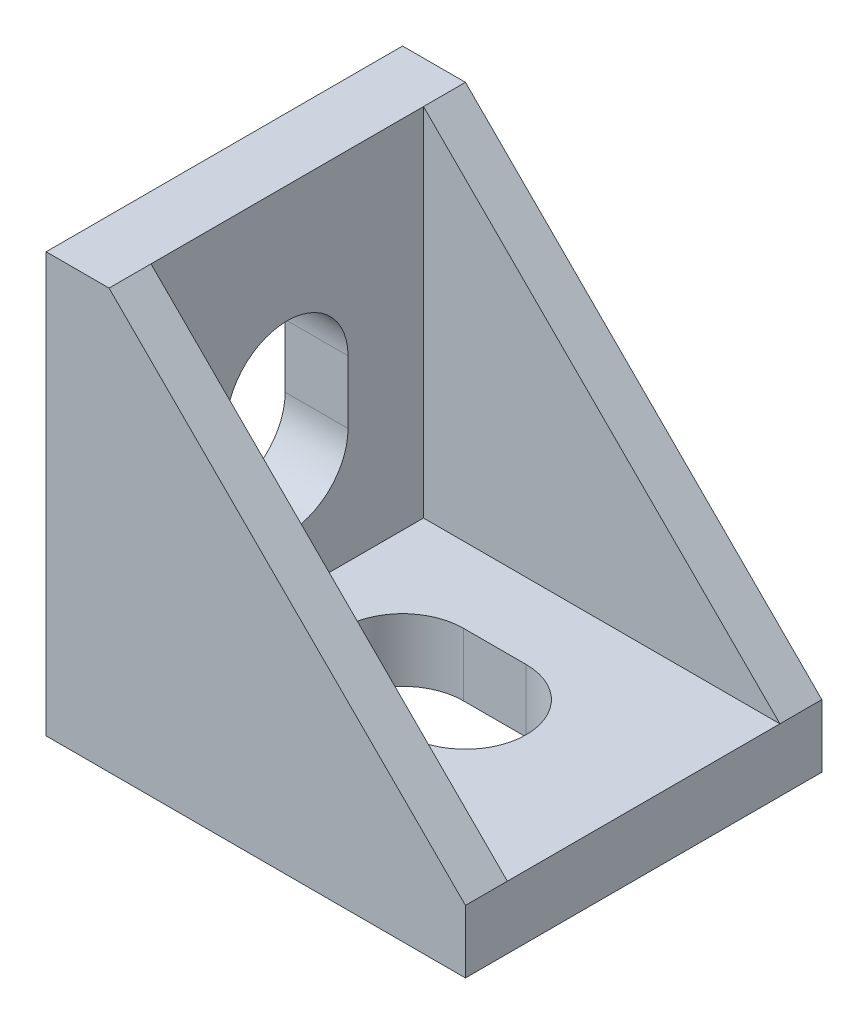
ISO-10303-21;
HEADER;
FILE_DESCRIPTION(('STEP AP214'),'2;1');
FILE_NAME('part.step','',(''),(''),'','','');
FILE_SCHEMA(('AUTOMOTIVE_DESIGN { 1 0 10303 214 1 1 1 1 }'));
ENDSEC;
DATA;
#1=APPLICATION_CONTEXT('core data for automotive mechanical design processes');
#2=APPLICATION_PROTOCOL_DEFINITION('international standard','automotive_design',2000,#1);
#3=PRODUCT_CONTEXT('',#1,'mechanical');
#4=PRODUCT('Part','Part','',(#3));
#5=PRODUCT_RELATED_PRODUCT_CATEGORY('part','',(#4));
#6=PRODUCT_DEFINITION_FORMATION('','',#4);
#7=PRODUCT_DEFINITION_CONTEXT('part definition',#1,'design');
#8=PRODUCT_DEFINITION('design','',#6,#7);
#9=PRODUCT_DEFINITION_SHAPE('','',#8);
#10=(LENGTH_UNIT() NAMED_UNIT(*) SI_UNIT(.MILLI.,.METRE.));
#11=(NAMED_UNIT(*) PLANE_ANGLE_UNIT() SI_UNIT($,.RADIAN.));
#12=(NAMED_UNIT(*) SI_UNIT($,.STERADIAN.) SOLID_ANGLE_UNIT());
#13=UNCERTAINTY_MEASURE_WITH_UNIT(LENGTH_MEASURE(1.E-05),#10,'distance_accuracy_value','');
#14=(GEOMETRIC_REPRESENTATION_CONTEXT(3) GLOBAL_UNCERTAINTY_ASSIGNED_CONTEXT((#13)) GLOBAL_UNIT_ASSIGNED_CONTEXT((#10,
#11,#12)) REPRESENTATION_CONTEXT('',''));
#15=CARTESIAN_POINT('',(0.,0.,0.));
#16=DIRECTION('',(0.,0.,1.));
#17=DIRECTION('',(1.,0.,0.));
#18=AXIS2_PLACEMENT_3D('',#15,#16,#17);
#19=CARTESIAN_POINT('',(20.,0.,8.5));
#20=DIRECTION('',(0.,1.,0.));
#21=DIRECTION('',(-1.,0.,0.));
#22=AXIS2_PLACEMENT_3D('',#19,#20,#21);
#23=PLANE('',#22);
#24=DIRECTION('',(0.,0.,1.));
#25=VECTOR('',#24,1.);
#26=CARTESIAN_POINT('',(3.35,0.,2.));
#27=LINE('',#26,#25);
#28=CARTESIAN_POINT('',(3.35,0.,-2.));
#29=VERTEX_POINT('',#28);
#30=CARTESIAN_POINT('',(3.35,0.,2.));
#31=VERTEX_POINT('',#30);
#32=EDGE_CURVE('E266',#29,#31,#27,.T.);
#33=ORIENTED_EDGE('',*,*,#32,.F.);
#34=DIRECTION('',(1.,0.,0.));
#35=VECTOR('',#34,1.);
#36=CARTESIAN_POINT('',(1.5,0.,-2.));
#37=LINE('',#36,#35);
#38=CARTESIAN_POINT('',(1.5,0.,-2.));
#39=VERTEX_POINT('',#38);
#40=EDGE_CURVE('E279',#39,#29,#37,.T.);
#41=ORIENTED_EDGE('',*,*,#40,.F.);
#42=DIRECTION('',(0.,0.,-1.));
#43=VECTOR('',#42,1.);
#44=CARTESIAN_POINT('',(1.5,0.,2.));
#45=LINE('',#44,#43);
#46=CARTESIAN_POINT('',(1.5,0.,2.));
#47=VERTEX_POINT('',#46);
#48=EDGE_CURVE('E288',#47,#39,#45,.T.);
#49=ORIENTED_EDGE('',*,*,#48,.F.);
#50=DIRECTION('',(-1.,0.,0.));
#51=VECTOR('',#50,1.);
#52=CARTESIAN_POINT('',(1.5,0.,2.));
#53=LINE('',#52,#51);
#54=EDGE_CURVE('E269',#31,#47,#53,.T.);
#55=ORIENTED_EDGE('',*,*,#54,.F.);
#56=EDGE_LOOP('',(#33,#41,#49,#55));
#57=FACE_BOUND('',#56,.T.);
#58=DIRECTION('',(1.,0.,0.));
#59=VECTOR('',#58,1.);
#60=CARTESIAN_POINT('',(11.5,0.,2.9));
#61=LINE('',#60,#59);
#62=CARTESIAN_POINT('',(8.5,0.,2.9));
#63=VERTEX_POINT('',#62);
#64=CARTESIAN_POINT('',(11.5,0.,2.9));
#65=VERTEX_POINT('',#64);
#66=EDGE_CURVE('E381',#63,#65,#61,.T.);
#67=ORIENTED_EDGE('',*,*,#66,.T.);
#68=CARTESIAN_POINT('',(11.5,0.,0.));
#69=DIRECTION('',(0.,1.,0.));
#70=DIRECTION('',(-1.,0.,0.));
#71=AXIS2_PLACEMENT_3D('',#68,#69,#70);
#72=CIRCLE('',#71,2.9);
#73=CARTESIAN_POINT('',(11.5,0.,-2.9));
#74=VERTEX_POINT('',#73);
#75=EDGE_CURVE('E371',#65,#74,#72,.T.);
#76=ORIENTED_EDGE('',*,*,#75,.T.);
#77=DIRECTION('',(-1.,0.,0.));
#78=VECTOR('',#77,1.);
#79=CARTESIAN_POINT('',(11.5,0.,-2.9));
#80=LINE('',#79,#78);
#81=CARTESIAN_POINT('',(8.5,0.,-2.9));
#82=VERTEX_POINT('',#81);
#83=EDGE_CURVE('E374',#74,#82,#80,.T.);
#84=ORIENTED_EDGE('',*,*,#83,.T.);
#85=CARTESIAN_POINT('',(8.5,0.,0.));
#86=DIRECTION('',(0.,1.,0.));
#87=DIRECTION('',(-1.,0.,0.));
#88=AXIS2_PLACEMENT_3D('',#85,#86,#87);
#89=CIRCLE('',#88,2.9);
#90=EDGE_CURVE('E378',#82,#63,#89,.T.);
#91=ORIENTED_EDGE('',*,*,#90,.T.);
#92=EDGE_LOOP('',(#67,#76,#84,#91));
#93=FACE_BOUND('',#92,.T.);
#94=DIRECTION('',(1.,0.,0.));
#95=VECTOR('',#94,1.);
#96=CARTESIAN_POINT('',(20.,0.,-8.5));
#97=LINE('',#96,#95);
#98=CARTESIAN_POINT('',(0.,0.,-8.5));
#99=VERTEX_POINT('',#98);
#100=CARTESIAN_POINT('',(20.,0.,-8.5));
#101=VERTEX_POINT('',#100);
#102=EDGE_CURVE('E455',#99,#101,#97,.T.);
#103=ORIENTED_EDGE('',*,*,#102,.T.);
#104=DIRECTION('',(0.,0.,-1.));
#105=VECTOR('',#104,1.);
#106=CARTESIAN_POINT('',(20.,0.,8.5));
#107=LINE('',#106,#105);
#108=CARTESIAN_POINT('',(20.,0.,8.5));
#109=VERTEX_POINT('',#108);
#110=EDGE_CURVE('E11',#109,#101,#107,.T.);
#111=ORIENTED_EDGE('',*,*,#110,.F.);
#112=DIRECTION('',(1.,0.,0.));
#113=VECTOR('',#112,1.);
#114=CARTESIAN_POINT('',(20.,0.,8.5));
#115=LINE('',#114,#113);
#116=CARTESIAN_POINT('',(0.,0.,8.5));
#117=VERTEX_POINT('',#116);
#118=EDGE_CURVE('E459',#117,#109,#115,.T.);
#119=ORIENTED_EDGE('',*,*,#118,.F.);
#120=DIRECTION('',(0.,0.,-1.));
#121=VECTOR('',#120,1.);
#122=CARTESIAN_POINT('',(0.,0.,8.5));
#123=LINE('',#122,#121);
#124=EDGE_CURVE('E471',#117,#99,#123,.T.);
#125=ORIENTED_EDGE('',*,*,#124,.T.);
#126=EDGE_LOOP('',(#103,#111,#119,#125));
#127=FACE_BOUND('',#126,.T.);
#128=DIRECTION('',(0.,0.,1.));
#129=VECTOR('',#128,1.);
#130=CARTESIAN_POINT('',(18.5,0.,2.));
#131=LINE('',#130,#129);
#132=CARTESIAN_POINT('',(18.5,0.,-2.));
#133=VERTEX_POINT('',#132);
#134=CARTESIAN_POINT('',(18.5,0.,2.));
#135=VERTEX_POINT('',#134);
#136=EDGE_CURVE('E265',#133,#135,#131,.T.);
#137=ORIENTED_EDGE('',*,*,#136,.F.);
#138=DIRECTION('',(1.,0.,0.));
#139=VECTOR('',#138,1.);
#140=CARTESIAN_POINT('',(18.5,0.,-2.));
#141=LINE('',#140,#139);
#142=CARTESIAN_POINT('',(16.65,0.,-2.));
#143=VERTEX_POINT('',#142);
#144=EDGE_CURVE('E262',#143,#133,#141,.T.);
#145=ORIENTED_EDGE('',*,*,#144,.F.);
#146=DIRECTION('',(0.,0.,-1.));
#147=VECTOR('',#146,1.);
#148=CARTESIAN_POINT('',(16.65,0.,2.));
#149=LINE('',#148,#147);
#150=CARTESIAN_POINT('',(16.65,0.,2.));
#151=VERTEX_POINT('',#150);
#152=EDGE_CURVE('E56',#151,#143,#149,.T.);
#153=ORIENTED_EDGE('',*,*,#152,.F.);
#154=DIRECTION('',(-1.,0.,0.));
#155=VECTOR('',#154,1.);
#156=CARTESIAN_POINT('',(18.5,0.,2.));
#157=LINE('',#156,#155);
#158=EDGE_CURVE('E51',#135,#151,#157,.T.);
#159=ORIENTED_EDGE('',*,*,#158,.F.);
#160=EDGE_LOOP('',(#137,#145,#153,#159));
#161=FACE_BOUND('',#160,.T.);
#162=ADVANCED_FACE('F37',(#57,#93,#127,#161),#23,.F.);
#163=CARTESIAN_POINT('',(0.,0.,8.5));
#164=DIRECTION('',(1.,0.,0.));
#165=DIRECTION('',(0.,0.,-1.));
#166=AXIS2_PLACEMENT_3D('',#163,#164,#165);
#167=PLANE('',#166);
#168=DIRECTION('',(0.,1.,0.));
#169=VECTOR('',#168,1.);
#170=CARTESIAN_POINT('',(0.,18.5,2.));
#171=LINE('',#170,#169);
#172=CARTESIAN_POINT('',(0.,16.65,2.));
#173=VERTEX_POINT('',#172);
#174=CARTESIAN_POINT('',(0.,18.5,2.));
#175=VERTEX_POINT('',#174);
#176=EDGE_CURVE('E337',#173,#175,#171,.T.);
#177=ORIENTED_EDGE('',*,*,#176,.F.);
#178=DIRECTION('',(0.,0.,1.));
#179=VECTOR('',#178,1.);
#180=CARTESIAN_POINT('',(0.,16.65,-2.));
#181=LINE('',#180,#179);
#182=CARTESIAN_POINT('',(0.,16.65,-2.));
#183=VERTEX_POINT('',#182);
#184=EDGE_CURVE('E342',#183,#173,#181,.T.);
#185=ORIENTED_EDGE('',*,*,#184,.F.);
#186=DIRECTION('',(0.,-1.,0.));
#187=VECTOR('',#186,1.);
#188=CARTESIAN_POINT('',(0.,18.5,-2.));
#189=LINE('',#188,#187);
#190=CARTESIAN_POINT('',(0.,18.5,-2.));
#191=VERTEX_POINT('',#190);
#192=EDGE_CURVE('E354',#191,#183,#189,.T.);
#193=ORIENTED_EDGE('',*,*,#192,.F.);
#194=DIRECTION('',(0.,0.,-1.));
#195=VECTOR('',#194,1.);
#196=CARTESIAN_POINT('',(0.,18.5,-2.));
#197=LINE('',#196,#195);
#198=EDGE_CURVE('E351',#175,#191,#197,.T.);
#199=ORIENTED_EDGE('',*,*,#198,.F.);
#200=EDGE_LOOP('',(#177,#185,#193,#199));
#201=FACE_BOUND('',#200,.T.);
#202=DIRECTION('',(0.,1.,0.));
#203=VECTOR('',#202,1.);
#204=CARTESIAN_POINT('',(0.,11.5,-2.9));
#205=LINE('',#204,#203);
#206=CARTESIAN_POINT('',(0.,8.5,-2.9));
#207=VERTEX_POINT('',#206);
#208=CARTESIAN_POINT('',(0.,11.5,-2.9));
#209=VERTEX_POINT('',#208);
#210=EDGE_CURVE('E413',#207,#209,#205,.T.);
#211=ORIENTED_EDGE('',*,*,#210,.T.);
#212=CARTESIAN_POINT('',(0.,11.5,0.));
#213=DIRECTION('',(1.,0.,0.));
#214=DIRECTION('',(0.,1.,0.));
#215=AXIS2_PLACEMENT_3D('',#212,#213,#214);
#216=CIRCLE('',#215,2.9);
#217=CARTESIAN_POINT('',(0.,11.5,2.9));
#218=VERTEX_POINT('',#217);
#219=EDGE_CURVE('E403',#209,#218,#216,.T.);
#220=ORIENTED_EDGE('',*,*,#219,.T.);
#221=DIRECTION('',(0.,-1.,0.));
#222=VECTOR('',#221,1.);
#223=CARTESIAN_POINT('',(0.,11.5,2.9));
#224=LINE('',#223,#222);
#225=CARTESIAN_POINT('',(0.,8.5,2.9));
#226=VERTEX_POINT('',#225);
#227=EDGE_CURVE('E406',#218,#226,#224,.T.);
#228=ORIENTED_EDGE('',*,*,#227,.T.);
#229=CARTESIAN_POINT('',(0.,8.5,0.));
#230=DIRECTION('',(1.,0.,0.));
#231=DIRECTION('',(0.,1.,0.));
#232=AXIS2_PLACEMENT_3D('',#229,#230,#231);
#233=CIRCLE('',#232,2.9);
#234=EDGE_CURVE('E410',#226,#207,#233,.T.);
#235=ORIENTED_EDGE('',*,*,#234,.T.);
#236=EDGE_LOOP('',(#211,#220,#228,#235));
#237=FACE_BOUND('',#236,.T.);
#238=DIRECTION('',(0.,-1.,0.));
#239=VECTOR('',#238,1.);
#240=CARTESIAN_POINT('',(0.,0.,-8.5));
#241=LINE('',#240,#239);
#242=CARTESIAN_POINT('',(0.,20.,-8.5));
#243=VERTEX_POINT('',#242);
#244=EDGE_CURVE('E463',#243,#99,#241,.T.);
#245=ORIENTED_EDGE('',*,*,#244,.T.);
#246=ORIENTED_EDGE('',*,*,#124,.F.);
#247=DIRECTION('',(0.,-1.,0.));
#248=VECTOR('',#247,1.);
#249=CARTESIAN_POINT('',(0.,0.,8.5));
#250=LINE('',#249,#248);
#251=CARTESIAN_POINT('',(0.,20.,8.5));
#252=VERTEX_POINT('',#251);
#253=EDGE_CURVE('E469',#252,#117,#250,.T.);
#254=ORIENTED_EDGE('',*,*,#253,.F.);
#255=DIRECTION('',(0.,0.,-1.));
#256=VECTOR('',#255,1.);
#257=CARTESIAN_POINT('',(0.,20.,8.5));
#258=LINE('',#257,#256);
#259=EDGE_CURVE('E485',#252,#243,#258,.T.);
#260=ORIENTED_EDGE('',*,*,#259,.T.);
#261=EDGE_LOOP('',(#245,#246,#254,#260));
#262=FACE_BOUND('',#261,.T.);
#263=DIRECTION('',(0.,-1.,0.));
#264=VECTOR('',#263,1.);
#265=CARTESIAN_POINT('',(0.,1.5,-2.));
#266=LINE('',#265,#264);
#267=CARTESIAN_POINT('',(0.,3.35,-2.));
#268=VERTEX_POINT('',#267);
#269=CARTESIAN_POINT('',(0.,1.5,-2.));
#270=VERTEX_POINT('',#269);
#271=EDGE_CURVE('E304',#268,#270,#266,.T.);
#272=ORIENTED_EDGE('',*,*,#271,.F.);
#273=DIRECTION('',(0.,0.,-1.));
#274=VECTOR('',#273,1.);
#275=CARTESIAN_POINT('',(0.,3.35,-2.));
#276=LINE('',#275,#274);
#277=CARTESIAN_POINT('',(0.,3.35,2.));
#278=VERTEX_POINT('',#277);
#279=EDGE_CURVE('E309',#278,#268,#276,.T.);
#280=ORIENTED_EDGE('',*,*,#279,.F.);
#281=DIRECTION('',(0.,1.,0.));
#282=VECTOR('',#281,1.);
#283=CARTESIAN_POINT('',(0.,1.5,2.));
#284=LINE('',#283,#282);
#285=CARTESIAN_POINT('',(0.,1.5,2.));
#286=VERTEX_POINT('',#285);
#287=EDGE_CURVE('E321',#286,#278,#284,.T.);
#288=ORIENTED_EDGE('',*,*,#287,.F.);
#289=DIRECTION('',(0.,0.,1.));
#290=VECTOR('',#289,1.);
#291=CARTESIAN_POINT('',(0.,1.5,-2.));
#292=LINE('',#291,#290);
#293=EDGE_CURVE('E318',#270,#286,#292,.T.);
#294=ORIENTED_EDGE('',*,*,#293,.F.);
#295=EDGE_LOOP('',(#272,#280,#288,#294));
#296=FACE_BOUND('',#295,.T.);
#297=ADVANCED_FACE('F517',(#201,#237,#262,#296),#167,.F.);
#298=CARTESIAN_POINT('',(3.,20.,8.5));
#299=DIRECTION('',(-0.707106781186548,-0.707106781186548,0.));
#300=DIRECTION('',(0.707106781186548,-0.707106781186548,0.));
#301=AXIS2_PLACEMENT_3D('',#298,#299,#300);
#302=PLANE('',#301);
#303=DIRECTION('',(-0.707106781186547,0.707106781186547,0.));
#304=VECTOR('',#303,1.);
#305=CARTESIAN_POINT('',(3.,20.,6.5));
#306=LINE('',#305,#304);
#307=CARTESIAN_POINT('',(20.,3.,6.5));
#308=VERTEX_POINT('',#307);
#309=CARTESIAN_POINT('',(3.,20.,6.5));
#310=VERTEX_POINT('',#309);
#311=EDGE_CURVE('E428',#308,#310,#306,.T.);
#312=ORIENTED_EDGE('',*,*,#311,.T.);
#313=DIRECTION('',(0.,0.,-1.));
#314=VECTOR('',#313,1.);
#315=CARTESIAN_POINT('',(3.,20.,8.5));
#316=LINE('',#315,#314);
#317=CARTESIAN_POINT('',(3.,20.,8.5));
#318=VERTEX_POINT('',#317);
#319=EDGE_CURVE('E489',#318,#310,#316,.T.);
#320=ORIENTED_EDGE('',*,*,#319,.F.);
#321=DIRECTION('',(-0.707106781186547,0.707106781186547,0.));
#322=VECTOR('',#321,1.);
#323=CARTESIAN_POINT('',(3.,20.,8.5));
#324=LINE('',#323,#322);
#325=CARTESIAN_POINT('',(20.,3.,8.5));
#326=VERTEX_POINT('',#325);
#327=EDGE_CURVE('E465',#326,#318,#324,.T.);
#328=ORIENTED_EDGE('',*,*,#327,.F.);
#329=DIRECTION('',(0.,0.,-1.));
#330=VECTOR('',#329,1.);
#331=CARTESIAN_POINT('',(20.,3.,8.5));
#332=LINE('',#331,#330);
#333=EDGE_CURVE('E44',#326,#308,#332,.T.);
#334=ORIENTED_EDGE('',*,*,#333,.T.);
#335=EDGE_LOOP('',(#312,#320,#328,#334));
#336=FACE_BOUND('',#335,.T.);
#337=ADVANCED_FACE('F524',(#336),#302,.F.);
#338=CARTESIAN_POINT('',(20.,3.,8.5));
#339=DIRECTION('',(-1.,0.,0.));
#340=DIRECTION('',(0.,0.,1.));
#341=AXIS2_PLACEMENT_3D('',#338,#339,#340);
#342=PLANE('',#341);
#343=DIRECTION('',(0.,1.,0.));
#344=VECTOR('',#343,1.);
#345=CARTESIAN_POINT('',(20.,3.,-8.5));
#346=LINE('',#345,#344);
#347=CARTESIAN_POINT('',(20.,3.,-8.5));
#348=VERTEX_POINT('',#347);
#349=EDGE_CURVE('E474',#101,#348,#346,.T.);
#350=ORIENTED_EDGE('',*,*,#349,.T.);
#351=CARTESIAN_POINT('',(20.,3.,-6.5));
#352=VERTEX_POINT('',#351);
#353=EDGE_CURVE('E491',#352,#348,#332,.T.);
#354=ORIENTED_EDGE('',*,*,#353,.F.);
#355=DIRECTION('',(0.,0.,1.));
#356=VECTOR('',#355,1.);
#357=CARTESIAN_POINT('',(20.,3.,-6.5));
#358=LINE('',#357,#356);
#359=EDGE_CURVE('E452',#352,#308,#358,.T.);
#360=ORIENTED_EDGE('',*,*,#359,.T.);
#361=ORIENTED_EDGE('',*,*,#333,.F.);
#362=DIRECTION('',(0.,1.,0.));
#363=VECTOR('',#362,1.);
#364=CARTESIAN_POINT('',(20.,3.,8.5));
#365=LINE('',#364,#363);
#366=EDGE_CURVE('E462',#109,#326,#365,.T.);
#367=ORIENTED_EDGE('',*,*,#366,.F.);
#368=ORIENTED_EDGE('',*,*,#110,.T.);
#369=EDGE_LOOP('',(#350,#354,#360,#361,#367,#368));
#370=FACE_BOUND('',#369,.T.);
#371=ADVANCED_FACE('F504',(#370),#342,.F.);
#372=CARTESIAN_POINT('',(3.,20.,-6.5));
#373=VERTEX_POINT('',#372);
#374=CARTESIAN_POINT('',(3.,20.,-8.5));
#375=VERTEX_POINT('',#374);
#376=EDGE_CURVE('E488',#373,#375,#316,.T.);
#377=ORIENTED_EDGE('',*,*,#376,.F.);
#378=DIRECTION('',(-0.707106781186547,0.707106781186547,0.));
#379=VECTOR('',#378,1.);
#380=CARTESIAN_POINT('',(3.,20.,-6.5));
#381=LINE('',#380,#379);
#382=EDGE_CURVE('E435',#352,#373,#381,.T.);
#383=ORIENTED_EDGE('',*,*,#382,.F.);
#384=ORIENTED_EDGE('',*,*,#353,.T.);
#385=DIRECTION('',(-0.707106781186547,0.707106781186547,0.));
#386=VECTOR('',#385,1.);
#387=CARTESIAN_POINT('',(3.,20.,-8.5));
#388=LINE('',#387,#386);
#389=EDGE_CURVE('E477',#348,#375,#388,.T.);
#390=ORIENTED_EDGE('',*,*,#389,.T.);
#391=EDGE_LOOP('',(#377,#383,#384,#390));
#392=FACE_BOUND('',#391,.T.);
#393=ADVANCED_FACE('F500',(#392),#302,.F.);
#394=CARTESIAN_POINT('',(0.,20.,8.5));
#395=DIRECTION('',(0.,-1.,0.));
#396=DIRECTION('',(0.,0.,-1.));
#397=AXIS2_PLACEMENT_3D('',#394,#395,#396);
#398=PLANE('',#397);
#399=DIRECTION('',(-1.,0.,0.));
#400=VECTOR('',#399,1.);
#401=CARTESIAN_POINT('',(0.,20.,-8.5));
#402=LINE('',#401,#400);
#403=EDGE_CURVE('E480',#375,#243,#402,.T.);
#404=ORIENTED_EDGE('',*,*,#403,.T.);
#405=ORIENTED_EDGE('',*,*,#259,.F.);
#406=DIRECTION('',(-1.,0.,0.));
#407=VECTOR('',#406,1.);
#408=CARTESIAN_POINT('',(0.,20.,8.5));
#409=LINE('',#408,#407);
#410=EDGE_CURVE('E467',#318,#252,#409,.T.);
#411=ORIENTED_EDGE('',*,*,#410,.F.);
#412=ORIENTED_EDGE('',*,*,#319,.T.);
#413=DIRECTION('',(0.,0.,1.));
#414=VECTOR('',#413,1.);
#415=CARTESIAN_POINT('',(3.,20.,-6.5));
#416=LINE('',#415,#414);
#417=EDGE_CURVE('E444',#373,#310,#416,.T.);
#418=ORIENTED_EDGE('',*,*,#417,.F.);
#419=ORIENTED_EDGE('',*,*,#376,.T.);
#420=EDGE_LOOP('',(#404,#405,#411,#412,#418,#419));
#421=FACE_BOUND('',#420,.T.);
#422=ADVANCED_FACE('F512',(#421),#398,.F.);
#423=CARTESIAN_POINT('',(0.,0.,8.5));
#424=DIRECTION('',(0.,0.,-1.));
#425=DIRECTION('',(-1.,0.,0.));
#426=AXIS2_PLACEMENT_3D('',#423,#424,#425);
#427=PLANE('',#426);
#428=ORIENTED_EDGE('',*,*,#118,.T.);
#429=ORIENTED_EDGE('',*,*,#366,.T.);
#430=ORIENTED_EDGE('',*,*,#327,.T.);
#431=ORIENTED_EDGE('',*,*,#410,.T.);
#432=ORIENTED_EDGE('',*,*,#253,.T.);
#433=EDGE_LOOP('',(#428,#429,#430,#431,#432));
#434=FACE_BOUND('',#433,.T.);
#435=ADVANCED_FACE('F522',(#434),#427,.F.);
#436=CARTESIAN_POINT('',(0.,0.,-8.5));
#437=DIRECTION('',(0.,0.,-1.));
#438=DIRECTION('',(-1.,0.,0.));
#439=AXIS2_PLACEMENT_3D('',#436,#437,#438);
#440=PLANE('',#439);
#441=ORIENTED_EDGE('',*,*,#102,.F.);
#442=ORIENTED_EDGE('',*,*,#244,.F.);
#443=ORIENTED_EDGE('',*,*,#403,.F.);
#444=ORIENTED_EDGE('',*,*,#389,.F.);
#445=ORIENTED_EDGE('',*,*,#349,.F.);
#446=EDGE_LOOP('',(#441,#442,#443,#444,#445));
#447=FACE_BOUND('',#446,.T.);
#448=ADVANCED_FACE('F508',(#447),#440,.T.);
#449=CARTESIAN_POINT('',(20.,3.,-6.5));
#450=DIRECTION('',(0.,-1.,0.));
#451=DIRECTION('',(1.,0.,0.));
#452=AXIS2_PLACEMENT_3D('',#449,#450,#451);
#453=PLANE('',#452);
#454=DIRECTION('',(-1.,0.,0.));
#455=VECTOR('',#454,1.);
#456=CARTESIAN_POINT('',(11.5,3.,-2.9));
#457=LINE('',#456,#455);
#458=CARTESIAN_POINT('',(11.5,3.,-2.9));
#459=VERTEX_POINT('',#458);
#460=CARTESIAN_POINT('',(8.5,3.,-2.9));
#461=VERTEX_POINT('',#460);
#462=EDGE_CURVE('E386',#459,#461,#457,.T.);
#463=ORIENTED_EDGE('',*,*,#462,.F.);
#464=CARTESIAN_POINT('',(11.5,3.,0.));
#465=DIRECTION('',(0.,1.,0.));
#466=DIRECTION('',(-1.,0.,0.));
#467=AXIS2_PLACEMENT_3D('',#464,#465,#466);
#468=CIRCLE('',#467,2.9);
#469=CARTESIAN_POINT('',(11.5,3.,2.9));
#470=VERTEX_POINT('',#469);
#471=EDGE_CURVE('E370',#470,#459,#468,.T.);
#472=ORIENTED_EDGE('',*,*,#471,.F.);
#473=DIRECTION('',(1.,0.,0.));
#474=VECTOR('',#473,1.);
#475=CARTESIAN_POINT('',(11.5,3.,2.9));
#476=LINE('',#475,#474);
#477=CARTESIAN_POINT('',(8.5,3.,2.9));
#478=VERTEX_POINT('',#477);
#479=EDGE_CURVE('E375',#478,#470,#476,.T.);
#480=ORIENTED_EDGE('',*,*,#479,.F.);
#481=CARTESIAN_POINT('',(8.5,3.,0.));
#482=DIRECTION('',(0.,1.,0.));
#483=DIRECTION('',(-1.,0.,0.));
#484=AXIS2_PLACEMENT_3D('',#481,#482,#483);
#485=CIRCLE('',#484,2.9);
#486=EDGE_CURVE('E389',#461,#478,#485,.T.);
#487=ORIENTED_EDGE('',*,*,#486,.F.);
#488=EDGE_LOOP('',(#463,#472,#480,#487));
#489=FACE_BOUND('',#488,.T.);
#490=DIRECTION('',(1.,0.,0.));
#491=VECTOR('',#490,1.);
#492=CARTESIAN_POINT('',(20.,3.,6.5));
#493=LINE('',#492,#491);
#494=CARTESIAN_POINT('',(3.,3.,6.5));
#495=VERTEX_POINT('',#494);
#496=EDGE_CURVE('E438',#495,#308,#493,.T.);
#497=ORIENTED_EDGE('',*,*,#496,.T.);
#498=ORIENTED_EDGE('',*,*,#359,.F.);
#499=DIRECTION('',(1.,0.,0.));
#500=VECTOR('',#499,1.);
#501=CARTESIAN_POINT('',(20.,3.,-6.5));
#502=LINE('',#501,#500);
#503=CARTESIAN_POINT('',(3.,3.,-6.5));
#504=VERTEX_POINT('',#503);
#505=EDGE_CURVE('E441',#504,#352,#502,.T.);
#506=ORIENTED_EDGE('',*,*,#505,.F.);
#507=DIRECTION('',(0.,0.,1.));
#508=VECTOR('',#507,1.);
#509=CARTESIAN_POINT('',(3.,3.,-6.5));
#510=LINE('',#509,#508);
#511=EDGE_CURVE('E456',#504,#495,#510,.T.);
#512=ORIENTED_EDGE('',*,*,#511,.T.);
#513=EDGE_LOOP('',(#497,#498,#506,#512));
#514=FACE_BOUND('',#513,.T.);
#515=ADVANCED_FACE('F530',(#489,#514),#453,.F.);
#516=CARTESIAN_POINT('',(3.,20.,-6.5));
#517=DIRECTION('',(-1.,0.,0.));
#518=DIRECTION('',(0.,-1.,0.));
#519=AXIS2_PLACEMENT_3D('',#516,#517,#518);
#520=PLANE('',#519);
#521=DIRECTION('',(0.,-1.,0.));
#522=VECTOR('',#521,1.);
#523=CARTESIAN_POINT('',(3.,11.5,2.9));
#524=LINE('',#523,#522);
#525=CARTESIAN_POINT('',(3.,11.5,2.9));
#526=VERTEX_POINT('',#525);
#527=CARTESIAN_POINT('',(3.,8.5,2.9));
#528=VERTEX_POINT('',#527);
#529=EDGE_CURVE('E418',#526,#528,#524,.T.);
#530=ORIENTED_EDGE('',*,*,#529,.F.);
#531=CARTESIAN_POINT('',(3.,11.5,0.));
#532=DIRECTION('',(1.,0.,0.));
#533=DIRECTION('',(0.,1.,0.));
#534=AXIS2_PLACEMENT_3D('',#531,#532,#533);
#535=CIRCLE('',#534,2.9);
#536=CARTESIAN_POINT('',(3.,11.5,-2.9));
#537=VERTEX_POINT('',#536);
#538=EDGE_CURVE('E396',#537,#526,#535,.T.);
#539=ORIENTED_EDGE('',*,*,#538,.F.);
#540=DIRECTION('',(0.,1.,0.));
#541=VECTOR('',#540,1.);
#542=CARTESIAN_POINT('',(3.,11.5,-2.9));
#543=LINE('',#542,#541);
#544=CARTESIAN_POINT('',(3.,8.5,-2.9));
#545=VERTEX_POINT('',#544);
#546=EDGE_CURVE('E407',#545,#537,#543,.T.);
#547=ORIENTED_EDGE('',*,*,#546,.F.);
#548=CARTESIAN_POINT('',(3.,8.5,0.));
#549=DIRECTION('',(1.,0.,0.));
#550=DIRECTION('',(0.,1.,0.));
#551=AXIS2_PLACEMENT_3D('',#548,#549,#550);
#552=CIRCLE('',#551,2.9);
#553=EDGE_CURVE('E421',#528,#545,#552,.T.);
#554=ORIENTED_EDGE('',*,*,#553,.F.);
#555=EDGE_LOOP('',(#530,#539,#547,#554));
#556=FACE_BOUND('',#555,.T.);
#557=DIRECTION('',(0.,-1.,0.));
#558=VECTOR('',#557,1.);
#559=CARTESIAN_POINT('',(3.,20.,6.5));
#560=LINE('',#559,#558);
#561=EDGE_CURVE('E447',#310,#495,#560,.T.);
#562=ORIENTED_EDGE('',*,*,#561,.T.);
#563=ORIENTED_EDGE('',*,*,#511,.F.);
#564=DIRECTION('',(0.,-1.,0.));
#565=VECTOR('',#564,1.);
#566=CARTESIAN_POINT('',(3.,20.,-6.5));
#567=LINE('',#566,#565);
#568=EDGE_CURVE('E437',#373,#504,#567,.T.);
#569=ORIENTED_EDGE('',*,*,#568,.F.);
#570=ORIENTED_EDGE('',*,*,#417,.T.);
#571=EDGE_LOOP('',(#562,#563,#569,#570));
#572=FACE_BOUND('',#571,.T.);
#573=ADVANCED_FACE('F534',(#556,#572),#520,.F.);
#574=CARTESIAN_POINT('',(0.,0.,-6.5));
#575=DIRECTION('',(0.,0.,-1.));
#576=DIRECTION('',(-1.,0.,0.));
#577=AXIS2_PLACEMENT_3D('',#574,#575,#576);
#578=PLANE('',#577);
#579=ORIENTED_EDGE('',*,*,#382,.T.);
#580=ORIENTED_EDGE('',*,*,#568,.T.);
#581=ORIENTED_EDGE('',*,*,#505,.T.);
#582=EDGE_LOOP('',(#579,#580,#581));
#583=FACE_BOUND('',#582,.T.);
#584=ADVANCED_FACE('F536',(#583),#578,.F.);
#585=CARTESIAN_POINT('',(0.,0.,6.5));
#586=DIRECTION('',(0.,0.,-1.));
#587=DIRECTION('',(-1.,0.,0.));
#588=AXIS2_PLACEMENT_3D('',#585,#586,#587);
#589=PLANE('',#588);
#590=ORIENTED_EDGE('',*,*,#311,.F.);
#591=ORIENTED_EDGE('',*,*,#496,.F.);
#592=ORIENTED_EDGE('',*,*,#561,.F.);
#593=EDGE_LOOP('',(#590,#591,#592));
#594=FACE_BOUND('',#593,.T.);
#595=ADVANCED_FACE('F528',(#594),#589,.T.);
#596=CARTESIAN_POINT('',(0.,11.5,0.));
#597=DIRECTION('',(1.,0.,0.));
#598=DIRECTION('',(0.,1.,0.));
#599=AXIS2_PLACEMENT_3D('',#596,#597,#598);
#600=CYLINDRICAL_SURFACE('',#599,2.9);
#601=ORIENTED_EDGE('',*,*,#538,.T.);
#602=DIRECTION('',(1.,0.,0.));
#603=VECTOR('',#602,1.);
#604=CARTESIAN_POINT('',(0.,11.5,2.9));
#605=LINE('',#604,#603);
#606=EDGE_CURVE('E416',#218,#526,#605,.T.);
#607=ORIENTED_EDGE('',*,*,#606,.F.);
#608=ORIENTED_EDGE('',*,*,#219,.F.);
#609=DIRECTION('',(1.,0.,0.));
#610=VECTOR('',#609,1.);
#611=CARTESIAN_POINT('',(0.,11.5,-2.9));
#612=LINE('',#611,#610);
#613=EDGE_CURVE('E426',#209,#537,#612,.T.);
#614=ORIENTED_EDGE('',*,*,#613,.T.);
#615=EDGE_LOOP('',(#601,#607,#608,#614));
#616=FACE_BOUND('',#615,.T.);
#617=ADVANCED_FACE('F543',(#616),#600,.F.);
#618=CARTESIAN_POINT('',(0.,11.5,-2.9));
#619=DIRECTION('',(0.,0.,-1.));
#620=DIRECTION('',(0.,1.,0.));
#621=AXIS2_PLACEMENT_3D('',#618,#619,#620);
#622=PLANE('',#621);
#623=ORIENTED_EDGE('',*,*,#546,.T.);
#624=ORIENTED_EDGE('',*,*,#613,.F.);
#625=ORIENTED_EDGE('',*,*,#210,.F.);
#626=DIRECTION('',(1.,0.,0.));
#627=VECTOR('',#626,1.);
#628=CARTESIAN_POINT('',(0.,8.5,-2.9));
#629=LINE('',#628,#627);
#630=EDGE_CURVE('E429',#207,#545,#629,.T.);
#631=ORIENTED_EDGE('',*,*,#630,.T.);
#632=EDGE_LOOP('',(#623,#624,#625,#631));
#633=FACE_BOUND('',#632,.T.);
#634=ADVANCED_FACE('F663',(#633),#622,.F.);
#635=CARTESIAN_POINT('',(0.,8.5,0.));
#636=DIRECTION('',(1.,0.,0.));
#637=DIRECTION('',(0.,1.,0.));
#638=AXIS2_PLACEMENT_3D('',#635,#636,#637);
#639=CYLINDRICAL_SURFACE('',#638,2.9);
#640=ORIENTED_EDGE('',*,*,#553,.T.);
#641=ORIENTED_EDGE('',*,*,#630,.F.);
#642=ORIENTED_EDGE('',*,*,#234,.F.);
#643=DIRECTION('',(1.,0.,0.));
#644=VECTOR('',#643,1.);
#645=CARTESIAN_POINT('',(0.,8.5,2.9));
#646=LINE('',#645,#644);
#647=EDGE_CURVE('E431',#226,#528,#646,.T.);
#648=ORIENTED_EDGE('',*,*,#647,.T.);
#649=EDGE_LOOP('',(#640,#641,#642,#648));
#650=FACE_BOUND('',#649,.T.);
#651=ADVANCED_FACE('F666',(#650),#639,.F.);
#652=CARTESIAN_POINT('',(0.,11.5,2.9));
#653=DIRECTION('',(0.,0.,1.));
#654=DIRECTION('',(1.,0.,0.));
#655=AXIS2_PLACEMENT_3D('',#652,#653,#654);
#656=PLANE('',#655);
#657=ORIENTED_EDGE('',*,*,#529,.T.);
#658=ORIENTED_EDGE('',*,*,#647,.F.);
#659=ORIENTED_EDGE('',*,*,#227,.F.);
#660=ORIENTED_EDGE('',*,*,#606,.T.);
#661=EDGE_LOOP('',(#657,#658,#659,#660));
#662=FACE_BOUND('',#661,.T.);
#663=ADVANCED_FACE('F661',(#662),#656,.F.);
#664=CARTESIAN_POINT('',(11.5,0.,0.));
#665=DIRECTION('',(0.,1.,0.));
#666=DIRECTION('',(-1.,0.,0.));
#667=AXIS2_PLACEMENT_3D('',#664,#665,#666);
#668=CYLINDRICAL_SURFACE('',#667,2.9);
#669=ORIENTED_EDGE('',*,*,#471,.T.);
#670=DIRECTION('',(0.,1.,0.));
#671=VECTOR('',#670,1.);
#672=CARTESIAN_POINT('',(11.5,0.,-2.9));
#673=LINE('',#672,#671);
#674=EDGE_CURVE('E384',#74,#459,#673,.T.);
#675=ORIENTED_EDGE('',*,*,#674,.F.);
#676=ORIENTED_EDGE('',*,*,#75,.F.);
#677=DIRECTION('',(0.,1.,0.));
#678=VECTOR('',#677,1.);
#679=CARTESIAN_POINT('',(11.5,0.,2.9));
#680=LINE('',#679,#678);
#681=EDGE_CURVE('E394',#65,#470,#680,.T.);
#682=ORIENTED_EDGE('',*,*,#681,.T.);
#683=EDGE_LOOP('',(#669,#675,#676,#682));
#684=FACE_BOUND('',#683,.T.);
#685=ADVANCED_FACE('F651',(#684),#668,.F.);
#686=CARTESIAN_POINT('',(11.5,0.,2.9));
#687=DIRECTION('',(0.,0.,1.));
#688=DIRECTION('',(1.,0.,0.));
#689=AXIS2_PLACEMENT_3D('',#686,#687,#688);
#690=PLANE('',#689);
#691=ORIENTED_EDGE('',*,*,#479,.T.);
#692=ORIENTED_EDGE('',*,*,#681,.F.);
#693=ORIENTED_EDGE('',*,*,#66,.F.);
#694=DIRECTION('',(0.,1.,0.));
#695=VECTOR('',#694,1.);
#696=CARTESIAN_POINT('',(8.5,0.,2.9));
#697=LINE('',#696,#695);
#698=EDGE_CURVE('E397',#63,#478,#697,.T.);
#699=ORIENTED_EDGE('',*,*,#698,.T.);
#700=EDGE_LOOP('',(#691,#692,#693,#699));
#701=FACE_BOUND('',#700,.T.);
#702=ADVANCED_FACE('F647',(#701),#690,.F.);
#703=CARTESIAN_POINT('',(8.5,0.,0.));
#704=DIRECTION('',(0.,1.,0.));
#705=DIRECTION('',(-1.,0.,0.));
#706=AXIS2_PLACEMENT_3D('',#703,#704,#705);
#707=CYLINDRICAL_SURFACE('',#706,2.9);
#708=ORIENTED_EDGE('',*,*,#486,.T.);
#709=ORIENTED_EDGE('',*,*,#698,.F.);
#710=ORIENTED_EDGE('',*,*,#90,.F.);
#711=DIRECTION('',(0.,1.,0.));
#712=VECTOR('',#711,1.);
#713=CARTESIAN_POINT('',(8.5,0.,-2.9));
#714=LINE('',#713,#712);
#715=EDGE_CURVE('E399',#82,#461,#714,.T.);
#716=ORIENTED_EDGE('',*,*,#715,.T.);
#717=EDGE_LOOP('',(#708,#709,#710,#716));
#718=FACE_BOUND('',#717,.T.);
#719=ADVANCED_FACE('F650',(#718),#707,.F.);
#720=CARTESIAN_POINT('',(11.5,0.,-2.9));
#721=DIRECTION('',(0.,0.,-1.));
#722=DIRECTION('',(-1.,0.,0.));
#723=AXIS2_PLACEMENT_3D('',#720,#721,#722);
#724=PLANE('',#723);
#725=ORIENTED_EDGE('',*,*,#462,.T.);
#726=ORIENTED_EDGE('',*,*,#715,.F.);
#727=ORIENTED_EDGE('',*,*,#83,.F.);
#728=ORIENTED_EDGE('',*,*,#674,.T.);
#729=EDGE_LOOP('',(#725,#726,#727,#728));
#730=FACE_BOUND('',#729,.T.);
#731=ADVANCED_FACE('F645',(#730),#724,.F.);
#732=CARTESIAN_POINT('',(-1.,18.5,2.));
#733=DIRECTION('',(0.,0.,-1.));
#734=DIRECTION('',(0.,1.,0.));
#735=AXIS2_PLACEMENT_3D('',#732,#733,#734);
#736=PLANE('',#735);
#737=ORIENTED_EDGE('',*,*,#176,.T.);
#738=DIRECTION('',(1.,0.,0.));
#739=VECTOR('',#738,1.);
#740=CARTESIAN_POINT('',(-1.,18.5,2.));
#741=LINE('',#740,#739);
#742=CARTESIAN_POINT('',(-1.,18.5,2.));
#743=VERTEX_POINT('',#742);
#744=EDGE_CURVE('E367',#743,#175,#741,.T.);
#745=ORIENTED_EDGE('',*,*,#744,.F.);
#746=DIRECTION('',(0.,1.,0.));
#747=VECTOR('',#746,1.);
#748=CARTESIAN_POINT('',(-1.,18.5,2.));
#749=LINE('',#748,#747);
#750=CARTESIAN_POINT('',(-1.,16.65,2.));
#751=VERTEX_POINT('',#750);
#752=EDGE_CURVE('E338',#751,#743,#749,.T.);
#753=ORIENTED_EDGE('',*,*,#752,.F.);
#754=DIRECTION('',(1.,0.,0.));
#755=VECTOR('',#754,1.);
#756=CARTESIAN_POINT('',(-1.,16.65,2.));
#757=LINE('',#756,#755);
#758=EDGE_CURVE('E348',#751,#173,#757,.T.);
#759=ORIENTED_EDGE('',*,*,#758,.T.);
#760=EDGE_LOOP('',(#737,#745,#753,#759));
#761=FACE_BOUND('',#760,.T.);
#762=ADVANCED_FACE('F641',(#761),#736,.F.);
#763=CARTESIAN_POINT('',(-1.,18.5,-2.));
#764=DIRECTION('',(0.,-1.,0.));
#765=DIRECTION('',(0.,0.,-1.));
#766=AXIS2_PLACEMENT_3D('',#763,#764,#765);
#767=PLANE('',#766);
#768=ORIENTED_EDGE('',*,*,#198,.T.);
#769=DIRECTION('',(1.,0.,0.));
#770=VECTOR('',#769,1.);
#771=CARTESIAN_POINT('',(-1.,18.5,-2.));
#772=LINE('',#771,#770);
#773=CARTESIAN_POINT('',(-1.,18.5,-2.));
#774=VERTEX_POINT('',#773);
#775=EDGE_CURVE('E364',#774,#191,#772,.T.);
#776=ORIENTED_EDGE('',*,*,#775,.F.);
#777=DIRECTION('',(0.,0.,-1.));
#778=VECTOR('',#777,1.);
#779=CARTESIAN_POINT('',(-1.,18.5,-2.));
#780=LINE('',#779,#778);
#781=EDGE_CURVE('E341',#743,#774,#780,.T.);
#782=ORIENTED_EDGE('',*,*,#781,.F.);
#783=ORIENTED_EDGE('',*,*,#744,.T.);
#784=EDGE_LOOP('',(#768,#776,#782,#783));
#785=FACE_BOUND('',#784,.T.);
#786=ADVANCED_FACE('F637',(#785),#767,.F.);
#787=CARTESIAN_POINT('',(-1.,18.5,-2.));
#788=DIRECTION('',(0.,0.,1.));
#789=DIRECTION('',(0.,-1.,0.));
#790=AXIS2_PLACEMENT_3D('',#787,#788,#789);
#791=PLANE('',#790);
#792=ORIENTED_EDGE('',*,*,#192,.T.);
#793=DIRECTION('',(1.,0.,0.));
#794=VECTOR('',#793,1.);
#795=CARTESIAN_POINT('',(-1.,16.65,-2.));
#796=LINE('',#795,#794);
#797=CARTESIAN_POINT('',(-1.,16.65,-2.));
#798=VERTEX_POINT('',#797);
#799=EDGE_CURVE('E361',#798,#183,#796,.T.);
#800=ORIENTED_EDGE('',*,*,#799,.F.);
#801=DIRECTION('',(0.,-1.,0.));
#802=VECTOR('',#801,1.);
#803=CARTESIAN_POINT('',(-1.,18.5,-2.));
#804=LINE('',#803,#802);
#805=EDGE_CURVE('E344',#774,#798,#804,.T.);
#806=ORIENTED_EDGE('',*,*,#805,.F.);
#807=ORIENTED_EDGE('',*,*,#775,.T.);
#808=EDGE_LOOP('',(#792,#800,#806,#807));
#809=FACE_BOUND('',#808,.T.);
#810=ADVANCED_FACE('F633',(#809),#791,.F.);
#811=CARTESIAN_POINT('',(-1.,16.65,-2.));
#812=DIRECTION('',(0.,1.,0.));
#813=DIRECTION('',(0.,0.,1.));
#814=AXIS2_PLACEMENT_3D('',#811,#812,#813);
#815=PLANE('',#814);
#816=ORIENTED_EDGE('',*,*,#184,.T.);
#817=ORIENTED_EDGE('',*,*,#758,.F.);
#818=DIRECTION('',(0.,0.,1.));
#819=VECTOR('',#818,1.);
#820=CARTESIAN_POINT('',(-1.,16.65,-2.));
#821=LINE('',#820,#819);
#822=EDGE_CURVE('E346',#798,#751,#821,.T.);
#823=ORIENTED_EDGE('',*,*,#822,.F.);
#824=ORIENTED_EDGE('',*,*,#799,.T.);
#825=EDGE_LOOP('',(#816,#817,#823,#824));
#826=FACE_BOUND('',#825,.T.);
#827=ADVANCED_FACE('F629',(#826),#815,.F.);
#828=CARTESIAN_POINT('',(-1.,0.,0.));
#829=DIRECTION('',(-1.,0.,0.));
#830=DIRECTION('',(0.,0.,1.));
#831=AXIS2_PLACEMENT_3D('',#828,#829,#830);
#832=PLANE('',#831);
#833=ORIENTED_EDGE('',*,*,#752,.T.);
#834=ORIENTED_EDGE('',*,*,#781,.T.);
#835=ORIENTED_EDGE('',*,*,#805,.T.);
#836=ORIENTED_EDGE('',*,*,#822,.T.);
#837=EDGE_LOOP('',(#833,#834,#835,#836));
#838=FACE_BOUND('',#837,.T.);
#839=ADVANCED_FACE('F625',(#838),#832,.T.);
#840=CARTESIAN_POINT('',(-1.,1.5,-2.));
#841=DIRECTION('',(0.,0.,1.));
#842=DIRECTION('',(0.,-1.,0.));
#843=AXIS2_PLACEMENT_3D('',#840,#841,#842);
#844=PLANE('',#843);
#845=ORIENTED_EDGE('',*,*,#271,.T.);
#846=DIRECTION('',(1.,0.,0.));
#847=VECTOR('',#846,1.);
#848=CARTESIAN_POINT('',(-1.,1.5,-2.));
#849=LINE('',#848,#847);
#850=CARTESIAN_POINT('',(-1.,1.5,-2.));
#851=VERTEX_POINT('',#850);
#852=EDGE_CURVE('E334',#851,#270,#849,.T.);
#853=ORIENTED_EDGE('',*,*,#852,.F.);
#854=DIRECTION('',(0.,-1.,0.));
#855=VECTOR('',#854,1.);
#856=CARTESIAN_POINT('',(-1.,1.5,-2.));
#857=LINE('',#856,#855);
#858=CARTESIAN_POINT('',(-1.,3.35,-2.));
#859=VERTEX_POINT('',#858);
#860=EDGE_CURVE('E305',#859,#851,#857,.T.);
#861=ORIENTED_EDGE('',*,*,#860,.F.);
#862=DIRECTION('',(1.,0.,0.));
#863=VECTOR('',#862,1.);
#864=CARTESIAN_POINT('',(-1.,3.35,-2.));
#865=LINE('',#864,#863);
#866=EDGE_CURVE('E315',#859,#268,#865,.T.);
#867=ORIENTED_EDGE('',*,*,#866,.T.);
#868=EDGE_LOOP('',(#845,#853,#861,#867));
#869=FACE_BOUND('',#868,.T.);
#870=ADVANCED_FACE('F621',(#869),#844,.F.);
#871=CARTESIAN_POINT('',(-1.,1.5,-2.));
#872=DIRECTION('',(0.,1.,0.));
#873=DIRECTION('',(0.,0.,1.));
#874=AXIS2_PLACEMENT_3D('',#871,#872,#873);
#875=PLANE('',#874);
#876=ORIENTED_EDGE('',*,*,#293,.T.);
#877=DIRECTION('',(1.,0.,0.));
#878=VECTOR('',#877,1.);
#879=CARTESIAN_POINT('',(-1.,1.5,2.));
#880=LINE('',#879,#878);
#881=CARTESIAN_POINT('',(-1.,1.5,2.));
#882=VERTEX_POINT('',#881);
#883=EDGE_CURVE('E331',#882,#286,#880,.T.);
#884=ORIENTED_EDGE('',*,*,#883,.F.);
#885=DIRECTION('',(0.,0.,1.));
#886=VECTOR('',#885,1.);
#887=CARTESIAN_POINT('',(-1.,1.5,-2.));
#888=LINE('',#887,#886);
#889=EDGE_CURVE('E308',#851,#882,#888,.T.);
#890=ORIENTED_EDGE('',*,*,#889,.F.);
#891=ORIENTED_EDGE('',*,*,#852,.T.);
#892=EDGE_LOOP('',(#876,#884,#890,#891));
#893=FACE_BOUND('',#892,.T.);
#894=ADVANCED_FACE('F617',(#893),#875,.F.);
#895=CARTESIAN_POINT('',(-1.,1.5,2.));
#896=DIRECTION('',(0.,0.,-1.));
#897=DIRECTION('',(0.,1.,0.));
#898=AXIS2_PLACEMENT_3D('',#895,#896,#897);
#899=PLANE('',#898);
#900=ORIENTED_EDGE('',*,*,#287,.T.);
#901=DIRECTION('',(1.,0.,0.));
#902=VECTOR('',#901,1.);
#903=CARTESIAN_POINT('',(-1.,3.35,2.));
#904=LINE('',#903,#902);
#905=CARTESIAN_POINT('',(-1.,3.35,2.));
#906=VERTEX_POINT('',#905);
#907=EDGE_CURVE('E328',#906,#278,#904,.T.);
#908=ORIENTED_EDGE('',*,*,#907,.F.);
#909=DIRECTION('',(0.,1.,0.));
#910=VECTOR('',#909,1.);
#911=CARTESIAN_POINT('',(-1.,1.5,2.));
#912=LINE('',#911,#910);
#913=EDGE_CURVE('E311',#882,#906,#912,.T.);
#914=ORIENTED_EDGE('',*,*,#913,.F.);
#915=ORIENTED_EDGE('',*,*,#883,.T.);
#916=EDGE_LOOP('',(#900,#908,#914,#915));
#917=FACE_BOUND('',#916,.T.);
#918=ADVANCED_FACE('F613',(#917),#899,.F.);
#919=CARTESIAN_POINT('',(-1.,3.35,-2.));
#920=DIRECTION('',(0.,-1.,0.));
#921=DIRECTION('',(0.,0.,-1.));
#922=AXIS2_PLACEMENT_3D('',#919,#920,#921);
#923=PLANE('',#922);
#924=ORIENTED_EDGE('',*,*,#279,.T.);
#925=ORIENTED_EDGE('',*,*,#866,.F.);
#926=DIRECTION('',(0.,0.,-1.));
#927=VECTOR('',#926,1.);
#928=CARTESIAN_POINT('',(-1.,3.35,-2.));
#929=LINE('',#928,#927);
#930=EDGE_CURVE('E313',#906,#859,#929,.T.);
#931=ORIENTED_EDGE('',*,*,#930,.F.);
#932=ORIENTED_EDGE('',*,*,#907,.T.);
#933=EDGE_LOOP('',(#924,#925,#931,#932));
#934=FACE_BOUND('',#933,.T.);
#935=ADVANCED_FACE('F609',(#934),#923,.F.);
#936=CARTESIAN_POINT('',(-1.,0.,0.));
#937=DIRECTION('',(1.,0.,0.));
#938=DIRECTION('',(0.,0.,-1.));
#939=AXIS2_PLACEMENT_3D('',#936,#937,#938);
#940=PLANE('',#939);
#941=ORIENTED_EDGE('',*,*,#860,.T.);
#942=ORIENTED_EDGE('',*,*,#889,.T.);
#943=ORIENTED_EDGE('',*,*,#913,.T.);
#944=ORIENTED_EDGE('',*,*,#930,.T.);
#945=EDGE_LOOP('',(#941,#942,#943,#944));
#946=FACE_BOUND('',#945,.T.);
#947=ADVANCED_FACE('F606',(#946),#940,.F.);
#948=CARTESIAN_POINT('',(3.35,-1.,2.));
#949=DIRECTION('',(-1.,0.,0.));
#950=DIRECTION('',(0.,0.,1.));
#951=AXIS2_PLACEMENT_3D('',#948,#949,#950);
#952=PLANE('',#951);
#953=ORIENTED_EDGE('',*,*,#32,.T.);
#954=DIRECTION('',(0.,1.,0.));
#955=VECTOR('',#954,1.);
#956=CARTESIAN_POINT('',(3.35,-1.,2.));
#957=LINE('',#956,#955);
#958=CARTESIAN_POINT('',(3.35,-1.,2.));
#959=VERTEX_POINT('',#958);
#960=EDGE_CURVE('E301',#959,#31,#957,.T.);
#961=ORIENTED_EDGE('',*,*,#960,.F.);
#962=DIRECTION('',(0.,0.,1.));
#963=VECTOR('',#962,1.);
#964=CARTESIAN_POINT('',(3.35,-1.,2.));
#965=LINE('',#964,#963);
#966=CARTESIAN_POINT('',(3.35,-1.,-2.));
#967=VERTEX_POINT('',#966);
#968=EDGE_CURVE('E275',#967,#959,#965,.T.);
#969=ORIENTED_EDGE('',*,*,#968,.F.);
#970=DIRECTION('',(0.,1.,0.));
#971=VECTOR('',#970,1.);
#972=CARTESIAN_POINT('',(3.35,-1.,-2.));
#973=LINE('',#972,#971);
#974=EDGE_CURVE('E284',#967,#29,#973,.T.);
#975=ORIENTED_EDGE('',*,*,#974,.T.);
#976=EDGE_LOOP('',(#953,#961,#969,#975));
#977=FACE_BOUND('',#976,.T.);
#978=ADVANCED_FACE('F603',(#977),#952,.F.);
#979=CARTESIAN_POINT('',(1.5,-1.,2.));
#980=DIRECTION('',(0.,0.,-1.));
#981=DIRECTION('',(-1.,0.,0.));
#982=AXIS2_PLACEMENT_3D('',#979,#980,#981);
#983=PLANE('',#982);
#984=ORIENTED_EDGE('',*,*,#54,.T.);
#985=DIRECTION('',(0.,1.,0.));
#986=VECTOR('',#985,1.);
#987=CARTESIAN_POINT('',(1.5,-1.,2.));
#988=LINE('',#987,#986);
#989=CARTESIAN_POINT('',(1.5,-1.,2.));
#990=VERTEX_POINT('',#989);
#991=EDGE_CURVE('E298',#990,#47,#988,.T.);
#992=ORIENTED_EDGE('',*,*,#991,.F.);
#993=DIRECTION('',(-1.,0.,0.));
#994=VECTOR('',#993,1.);
#995=CARTESIAN_POINT('',(1.5,-1.,2.));
#996=LINE('',#995,#994);
#997=EDGE_CURVE('E278',#959,#990,#996,.T.);
#998=ORIENTED_EDGE('',*,*,#997,.F.);
#999=ORIENTED_EDGE('',*,*,#960,.T.);
#1000=EDGE_LOOP('',(#984,#992,#998,#999));
#1001=FACE_BOUND('',#1000,.T.);
#1002=ADVANCED_FACE('F599',(#1001),#983,.F.);
#1003=CARTESIAN_POINT('',(1.5,-1.,2.));
#1004=DIRECTION('',(1.,0.,0.));
#1005=DIRECTION('',(0.,1.,0.));
#1006=AXIS2_PLACEMENT_3D('',#1003,#1004,#1005);
#1007=PLANE('',#1006);
#1008=ORIENTED_EDGE('',*,*,#48,.T.);
#1009=DIRECTION('',(0.,1.,0.));
#1010=VECTOR('',#1009,1.);
#1011=CARTESIAN_POINT('',(1.5,-1.,-2.));
#1012=LINE('',#1011,#1010);
#1013=CARTESIAN_POINT('',(1.5,-1.,-2.));
#1014=VERTEX_POINT('',#1013);
#1015=EDGE_CURVE('E295',#1014,#39,#1012,.T.);
#1016=ORIENTED_EDGE('',*,*,#1015,.F.);
#1017=DIRECTION('',(0.,0.,-1.));
#1018=VECTOR('',#1017,1.);
#1019=CARTESIAN_POINT('',(1.5,-1.,2.));
#1020=LINE('',#1019,#1018);
#1021=EDGE_CURVE('E281',#990,#1014,#1020,.T.);
#1022=ORIENTED_EDGE('',*,*,#1021,.F.);
#1023=ORIENTED_EDGE('',*,*,#991,.T.);
#1024=EDGE_LOOP('',(#1008,#1016,#1022,#1023));
#1025=FACE_BOUND('',#1024,.T.);
#1026=ADVANCED_FACE('F595',(#1025),#1007,.F.);
#1027=CARTESIAN_POINT('',(1.5,-1.,-2.));
#1028=DIRECTION('',(0.,0.,1.));
#1029=DIRECTION('',(1.,0.,0.));
#1030=AXIS2_PLACEMENT_3D('',#1027,#1028,#1029);
#1031=PLANE('',#1030);
#1032=ORIENTED_EDGE('',*,*,#40,.T.);
#1033=ORIENTED_EDGE('',*,*,#974,.F.);
#1034=DIRECTION('',(1.,0.,0.));
#1035=VECTOR('',#1034,1.);
#1036=CARTESIAN_POINT('',(1.5,-1.,-2.));
#1037=LINE('',#1036,#1035);
#1038=EDGE_CURVE('E283',#1014,#967,#1037,.T.);
#1039=ORIENTED_EDGE('',*,*,#1038,.F.);
#1040=ORIENTED_EDGE('',*,*,#1015,.T.);
#1041=EDGE_LOOP('',(#1032,#1033,#1039,#1040));
#1042=FACE_BOUND('',#1041,.T.);
#1043=ADVANCED_FACE('F591',(#1042),#1031,.F.);
#1044=CARTESIAN_POINT('',(0.,-1.,0.));
#1045=DIRECTION('',(0.,-1.,0.));
#1046=DIRECTION('',(1.,0.,0.));
#1047=AXIS2_PLACEMENT_3D('',#1044,#1045,#1046);
#1048=PLANE('',#1047);
#1049=ORIENTED_EDGE('',*,*,#968,.T.);
#1050=ORIENTED_EDGE('',*,*,#997,.T.);
#1051=ORIENTED_EDGE('',*,*,#1021,.T.);
#1052=ORIENTED_EDGE('',*,*,#1038,.T.);
#1053=EDGE_LOOP('',(#1049,#1050,#1051,#1052));
#1054=FACE_BOUND('',#1053,.T.);
#1055=ADVANCED_FACE('F588',(#1054),#1048,.T.);
#1056=CARTESIAN_POINT('',(18.5,-1.,2.));
#1057=DIRECTION('',(-1.,0.,0.));
#1058=DIRECTION('',(0.,-1.,0.));
#1059=AXIS2_PLACEMENT_3D('',#1056,#1057,#1058);
#1060=PLANE('',#1059);
#1061=ORIENTED_EDGE('',*,*,#136,.T.);
#1062=DIRECTION('',(0.,1.,0.));
#1063=VECTOR('',#1062,1.);
#1064=CARTESIAN_POINT('',(18.5,-1.,2.));
#1065=LINE('',#1064,#1063);
#1066=CARTESIAN_POINT('',(18.5,-1.,2.));
#1067=VERTEX_POINT('',#1066);
#1068=EDGE_CURVE('E246',#1067,#135,#1065,.T.);
#1069=ORIENTED_EDGE('',*,*,#1068,.F.);
#1070=DIRECTION('',(0.,0.,1.));
#1071=VECTOR('',#1070,1.);
#1072=CARTESIAN_POINT('',(18.5,-1.,2.));
#1073=LINE('',#1072,#1071);
#1074=CARTESIAN_POINT('',(18.5,-1.,-2.));
#1075=VERTEX_POINT('',#1074);
#1076=EDGE_CURVE('E253',#1075,#1067,#1073,.T.);
#1077=ORIENTED_EDGE('',*,*,#1076,.F.);
#1078=DIRECTION('',(0.,1.,0.));
#1079=VECTOR('',#1078,1.);
#1080=CARTESIAN_POINT('',(18.5,-1.,-2.));
#1081=LINE('',#1080,#1079);
#1082=EDGE_CURVE('E566',#1075,#133,#1081,.T.);
#1083=ORIENTED_EDGE('',*,*,#1082,.T.);
#1084=EDGE_LOOP('',(#1061,#1069,#1077,#1083));
#1085=FACE_BOUND('',#1084,.T.);
#1086=ADVANCED_FACE('F264',(#1085),#1060,.F.);
#1087=CARTESIAN_POINT('',(18.5,-1.,2.));
#1088=DIRECTION('',(0.,0.,-1.));
#1089=DIRECTION('',(-1.,0.,0.));
#1090=AXIS2_PLACEMENT_3D('',#1087,#1088,#1089);
#1091=PLANE('',#1090);
#1092=ORIENTED_EDGE('',*,*,#158,.T.);
#1093=DIRECTION('',(0.,1.,0.));
#1094=VECTOR('',#1093,1.);
#1095=CARTESIAN_POINT('',(16.65,-1.,2.));
#1096=LINE('',#1095,#1094);
#1097=CARTESIAN_POINT('',(16.65,-1.,2.));
#1098=VERTEX_POINT('',#1097);
#1099=EDGE_CURVE('E249',#1098,#151,#1096,.T.);
#1100=ORIENTED_EDGE('',*,*,#1099,.F.);
#1101=DIRECTION('',(-1.,0.,0.));
#1102=VECTOR('',#1101,1.);
#1103=CARTESIAN_POINT('',(18.5,-1.,2.));
#1104=LINE('',#1103,#1102);
#1105=EDGE_CURVE('E242',#1067,#1098,#1104,.T.);
#1106=ORIENTED_EDGE('',*,*,#1105,.F.);
#1107=ORIENTED_EDGE('',*,*,#1068,.T.);
#1108=EDGE_LOOP('',(#1092,#1100,#1106,#1107));
#1109=FACE_BOUND('',#1108,.T.);
#1110=ADVANCED_FACE('F244',(#1109),#1091,.F.);
#1111=CARTESIAN_POINT('',(16.65,-1.,2.));
#1112=DIRECTION('',(1.,0.,0.));
#1113=DIRECTION('',(0.,1.,0.));
#1114=AXIS2_PLACEMENT_3D('',#1111,#1112,#1113);
#1115=PLANE('',#1114);
#1116=ORIENTED_EDGE('',*,*,#152,.T.);
#1117=DIRECTION('',(0.,1.,0.));
#1118=VECTOR('',#1117,1.);
#1119=CARTESIAN_POINT('',(16.65,-1.,-2.));
#1120=LINE('',#1119,#1118);
#1121=CARTESIAN_POINT('',(16.65,-1.,-2.));
#1122=VERTEX_POINT('',#1121);
#1123=EDGE_CURVE('E271',#1122,#143,#1120,.T.);
#1124=ORIENTED_EDGE('',*,*,#1123,.F.);
#1125=DIRECTION('',(0.,0.,-1.));
#1126=VECTOR('',#1125,1.);
#1127=CARTESIAN_POINT('',(16.65,-1.,2.));
#1128=LINE('',#1127,#1126);
#1129=EDGE_CURVE('E252',#1098,#1122,#1128,.T.);
#1130=ORIENTED_EDGE('',*,*,#1129,.F.);
#1131=ORIENTED_EDGE('',*,*,#1099,.T.);
#1132=EDGE_LOOP('',(#1116,#1124,#1130,#1131));
#1133=FACE_BOUND('',#1132,.T.);
#1134=ADVANCED_FACE('F575',(#1133),#1115,.F.);
#1135=CARTESIAN_POINT('',(18.5,-1.,-2.));
#1136=DIRECTION('',(0.,0.,1.));
#1137=DIRECTION('',(1.,0.,0.));
#1138=AXIS2_PLACEMENT_3D('',#1135,#1136,#1137);
#1139=PLANE('',#1138);
#1140=ORIENTED_EDGE('',*,*,#144,.T.);
#1141=ORIENTED_EDGE('',*,*,#1082,.F.);
#1142=DIRECTION('',(1.,0.,0.));
#1143=VECTOR('',#1142,1.);
#1144=CARTESIAN_POINT('',(18.5,-1.,-2.));
#1145=LINE('',#1144,#1143);
#1146=EDGE_CURVE('E258',#1122,#1075,#1145,.T.);
#1147=ORIENTED_EDGE('',*,*,#1146,.F.);
#1148=ORIENTED_EDGE('',*,*,#1123,.T.);
#1149=EDGE_LOOP('',(#1140,#1141,#1147,#1148));
#1150=FACE_BOUND('',#1149,.T.);
#1151=ADVANCED_FACE('F565',(#1150),#1139,.F.);
#1152=CARTESIAN_POINT('',(0.,-1.,0.));
#1153=DIRECTION('',(0.,1.,0.));
#1154=DIRECTION('',(-1.,0.,0.));
#1155=AXIS2_PLACEMENT_3D('',#1152,#1153,#1154);
#1156=PLANE('',#1155);
#1157=ORIENTED_EDGE('',*,*,#1076,.T.);
#1158=ORIENTED_EDGE('',*,*,#1105,.T.);
#1159=ORIENTED_EDGE('',*,*,#1129,.T.);
#1160=ORIENTED_EDGE('',*,*,#1146,.T.);
#1161=EDGE_LOOP('',(#1157,#1158,#1159,#1160));
#1162=FACE_BOUND('',#1161,.T.);
#1163=ADVANCED_FACE('F256',(#1162),#1156,.F.);
#1164=CLOSED_SHELL('',(#162,#297,#337,#371,#393,#422,#435,#448,#515,#573,#584,#595,#617,#634,
#651,#663,#685,#702,#719,#731,#762,#786,#810,#827,#839,#870,#894,#918,#935,#947,#978,#1002,
#1026,#1043,#1055,#1086,#1110,#1134,#1151,#1163));
#1165=MANIFOLD_SOLID_BREP('B2',#1164);
#1166=ADVANCED_BREP_SHAPE_REPRESENTATION('',(#18,#1165),#14);
#1167=SHAPE_DEFINITION_REPRESENTATION(#9,#1166);
ENDSEC;
END-ISO-10303-21;
